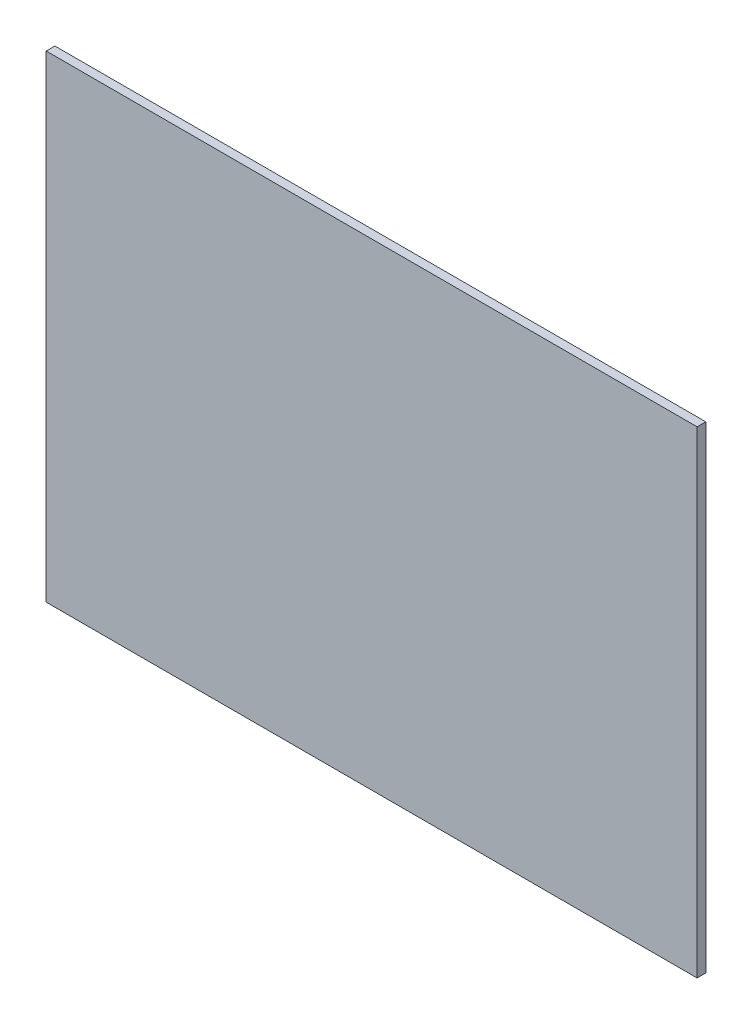
ISO-10303-21;
HEADER;
FILE_DESCRIPTION(('STEP AP214'),'2;1');
FILE_NAME('part.step','',(''),(''),'','','');
FILE_SCHEMA(('AUTOMOTIVE_DESIGN { 1 0 10303 214 1 1 1 1 }'));
ENDSEC;
DATA;
#1=APPLICATION_CONTEXT('core data for automotive mechanical design processes');
#2=APPLICATION_PROTOCOL_DEFINITION('international standard','automotive_design',2000,#1);
#3=PRODUCT_CONTEXT('',#1,'mechanical');
#4=PRODUCT('Part','Part','',(#3));
#5=PRODUCT_RELATED_PRODUCT_CATEGORY('part','',(#4));
#6=PRODUCT_DEFINITION_FORMATION('','',#4);
#7=PRODUCT_DEFINITION_CONTEXT('part definition',#1,'design');
#8=PRODUCT_DEFINITION('design','',#6,#7);
#9=PRODUCT_DEFINITION_SHAPE('','',#8);
#10=(LENGTH_UNIT() NAMED_UNIT(*) SI_UNIT(.MILLI.,.METRE.));
#11=(NAMED_UNIT(*) PLANE_ANGLE_UNIT() SI_UNIT($,.RADIAN.));
#12=(NAMED_UNIT(*) SI_UNIT($,.STERADIAN.) SOLID_ANGLE_UNIT());
#13=UNCERTAINTY_MEASURE_WITH_UNIT(LENGTH_MEASURE(1.E-05),#10,'distance_accuracy_value','');
#14=(GEOMETRIC_REPRESENTATION_CONTEXT(3) GLOBAL_UNCERTAINTY_ASSIGNED_CONTEXT((#13)) GLOBAL_UNIT_ASSIGNED_CONTEXT((#10,
#11,#12)) REPRESENTATION_CONTEXT('',''));
#15=CARTESIAN_POINT('',(0.,0.,0.));
#16=DIRECTION('',(0.,0.,1.));
#17=DIRECTION('',(1.,0.,0.));
#18=AXIS2_PLACEMENT_3D('',#15,#16,#17);
#19=CARTESIAN_POINT('',(0.,0.,5.08));
#20=DIRECTION('',(1.,0.,0.));
#21=DIRECTION('',(0.,0.,-1.));
#22=AXIS2_PLACEMENT_3D('',#19,#20,#21);
#23=PLANE('',#22);
#24=DIRECTION('',(0.,-1.,0.));
#25=VECTOR('',#24,1.);
#26=CARTESIAN_POINT('',(0.,0.,0.));
#27=LINE('',#26,#25);
#28=CARTESIAN_POINT('',(0.,279.4,0.));
#29=VERTEX_POINT('',#28);
#30=CARTESIAN_POINT('',(0.,0.,0.));
#31=VERTEX_POINT('',#30);
#32=EDGE_CURVE('E99',#29,#31,#27,.T.);
#33=ORIENTED_EDGE('',*,*,#32,.T.);
#34=DIRECTION('',(0.,0.,-1.));
#35=VECTOR('',#34,1.);
#36=CARTESIAN_POINT('',(0.,0.,5.08));
#37=LINE('',#36,#35);
#38=CARTESIAN_POINT('',(0.,0.,5.08));
#39=VERTEX_POINT('',#38);
#40=EDGE_CURVE('E11',#39,#31,#37,.T.);
#41=ORIENTED_EDGE('',*,*,#40,.F.);
#42=DIRECTION('',(0.,-1.,0.));
#43=VECTOR('',#42,1.);
#44=CARTESIAN_POINT('',(0.,0.,5.08));
#45=LINE('',#44,#43);
#46=CARTESIAN_POINT('',(0.,279.4,5.08));
#47=VERTEX_POINT('',#46);
#48=EDGE_CURVE('E87',#47,#39,#45,.T.);
#49=ORIENTED_EDGE('',*,*,#48,.F.);
#50=DIRECTION('',(0.,0.,-1.));
#51=VECTOR('',#50,1.);
#52=CARTESIAN_POINT('',(0.,279.4,5.08));
#53=LINE('',#52,#51);
#54=EDGE_CURVE('E95',#47,#29,#53,.T.);
#55=ORIENTED_EDGE('',*,*,#54,.T.);
#56=EDGE_LOOP('',(#33,#41,#49,#55));
#57=FACE_BOUND('',#56,.T.);
#58=ADVANCED_FACE('F36',(#57),#23,.F.);
#59=CARTESIAN_POINT('',(0.,0.,5.08));
#60=DIRECTION('',(0.,1.,0.));
#61=DIRECTION('',(0.,0.,1.));
#62=AXIS2_PLACEMENT_3D('',#59,#60,#61);
#63=PLANE('',#62);
#64=DIRECTION('',(1.,0.,0.));
#65=VECTOR('',#64,1.);
#66=CARTESIAN_POINT('',(0.,0.,0.));
#67=LINE('',#66,#65);
#68=CARTESIAN_POINT('',(381.,0.,0.));
#69=VERTEX_POINT('',#68);
#70=EDGE_CURVE('E91',#31,#69,#67,.T.);
#71=ORIENTED_EDGE('',*,*,#70,.T.);
#72=DIRECTION('',(0.,0.,-1.));
#73=VECTOR('',#72,1.);
#74=CARTESIAN_POINT('',(381.,0.,5.08));
#75=LINE('',#74,#73);
#76=CARTESIAN_POINT('',(381.,0.,5.08));
#77=VERTEX_POINT('',#76);
#78=EDGE_CURVE('E44',#77,#69,#75,.T.);
#79=ORIENTED_EDGE('',*,*,#78,.F.);
#80=DIRECTION('',(1.,0.,0.));
#81=VECTOR('',#80,1.);
#82=CARTESIAN_POINT('',(0.,0.,5.08));
#83=LINE('',#82,#81);
#84=EDGE_CURVE('E82',#39,#77,#83,.T.);
#85=ORIENTED_EDGE('',*,*,#84,.F.);
#86=ORIENTED_EDGE('',*,*,#40,.T.);
#87=EDGE_LOOP('',(#71,#79,#85,#86));
#88=FACE_BOUND('',#87,.T.);
#89=ADVANCED_FACE('F90',(#88),#63,.F.);
#90=CARTESIAN_POINT('',(381.,0.,5.08));
#91=DIRECTION('',(-1.,0.,0.));
#92=DIRECTION('',(0.,0.,1.));
#93=AXIS2_PLACEMENT_3D('',#90,#91,#92);
#94=PLANE('',#93);
#95=DIRECTION('',(0.,1.,0.));
#96=VECTOR('',#95,1.);
#97=CARTESIAN_POINT('',(381.,0.,0.));
#98=LINE('',#97,#96);
#99=CARTESIAN_POINT('',(381.,279.4,0.));
#100=VERTEX_POINT('',#99);
#101=EDGE_CURVE('E69',#69,#100,#98,.T.);
#102=ORIENTED_EDGE('',*,*,#101,.T.);
#103=DIRECTION('',(0.,0.,-1.));
#104=VECTOR('',#103,1.);
#105=CARTESIAN_POINT('',(381.,279.4,5.08));
#106=LINE('',#105,#104);
#107=CARTESIAN_POINT('',(381.,279.4,5.08));
#108=VERTEX_POINT('',#107);
#109=EDGE_CURVE('E92',#108,#100,#106,.T.);
#110=ORIENTED_EDGE('',*,*,#109,.F.);
#111=DIRECTION('',(0.,1.,0.));
#112=VECTOR('',#111,1.);
#113=CARTESIAN_POINT('',(381.,0.,5.08));
#114=LINE('',#113,#112);
#115=EDGE_CURVE('E85',#77,#108,#114,.T.);
#116=ORIENTED_EDGE('',*,*,#115,.F.);
#117=ORIENTED_EDGE('',*,*,#78,.T.);
#118=EDGE_LOOP('',(#102,#110,#116,#117));
#119=FACE_BOUND('',#118,.T.);
#120=ADVANCED_FACE('F93',(#119),#94,.F.);
#121=CARTESIAN_POINT('',(0.,279.4,5.08));
#122=DIRECTION('',(0.,-1.,0.));
#123=DIRECTION('',(0.,0.,-1.));
#124=AXIS2_PLACEMENT_3D('',#121,#122,#123);
#125=PLANE('',#124);
#126=DIRECTION('',(-1.,0.,0.));
#127=VECTOR('',#126,1.);
#128=CARTESIAN_POINT('',(0.,279.4,0.));
#129=LINE('',#128,#127);
#130=EDGE_CURVE('E75',#100,#29,#129,.T.);
#131=ORIENTED_EDGE('',*,*,#130,.T.);
#132=ORIENTED_EDGE('',*,*,#54,.F.);
#133=DIRECTION('',(-1.,0.,0.));
#134=VECTOR('',#133,1.);
#135=CARTESIAN_POINT('',(0.,279.4,5.08));
#136=LINE('',#135,#134);
#137=EDGE_CURVE('E52',#108,#47,#136,.T.);
#138=ORIENTED_EDGE('',*,*,#137,.F.);
#139=ORIENTED_EDGE('',*,*,#109,.T.);
#140=EDGE_LOOP('',(#131,#132,#138,#139));
#141=FACE_BOUND('',#140,.T.);
#142=ADVANCED_FACE('F106',(#141),#125,.F.);
#143=CARTESIAN_POINT('',(0.,0.,5.08));
#144=DIRECTION('',(0.,0.,-1.));
#145=DIRECTION('',(-1.,0.,0.));
#146=AXIS2_PLACEMENT_3D('',#143,#144,#145);
#147=PLANE('',#146);
#148=ORIENTED_EDGE('',*,*,#48,.T.);
#149=ORIENTED_EDGE('',*,*,#84,.T.);
#150=ORIENTED_EDGE('',*,*,#115,.T.);
#151=ORIENTED_EDGE('',*,*,#137,.T.);
#152=EDGE_LOOP('',(#148,#149,#150,#151));
#153=FACE_BOUND('',#152,.T.);
#154=ADVANCED_FACE('F83',(#153),#147,.F.);
#155=CARTESIAN_POINT('',(0.,0.,0.));
#156=DIRECTION('',(0.,0.,-1.));
#157=DIRECTION('',(-1.,0.,0.));
#158=AXIS2_PLACEMENT_3D('',#155,#156,#157);
#159=PLANE('',#158);
#160=ORIENTED_EDGE('',*,*,#32,.F.);
#161=ORIENTED_EDGE('',*,*,#130,.F.);
#162=ORIENTED_EDGE('',*,*,#101,.F.);
#163=ORIENTED_EDGE('',*,*,#70,.F.);
#164=EDGE_LOOP('',(#160,#161,#162,#163));
#165=FACE_BOUND('',#164,.T.);
#166=ADVANCED_FACE('F109',(#165),#159,.T.);
#167=CLOSED_SHELL('',(#58,#89,#120,#142,#154,#166));
#168=MANIFOLD_SOLID_BREP('B2',#167);
#169=ADVANCED_BREP_SHAPE_REPRESENTATION('',(#18,#168),#14);
#170=SHAPE_DEFINITION_REPRESENTATION(#9,#169);
ENDSEC;
END-ISO-10303-21;
